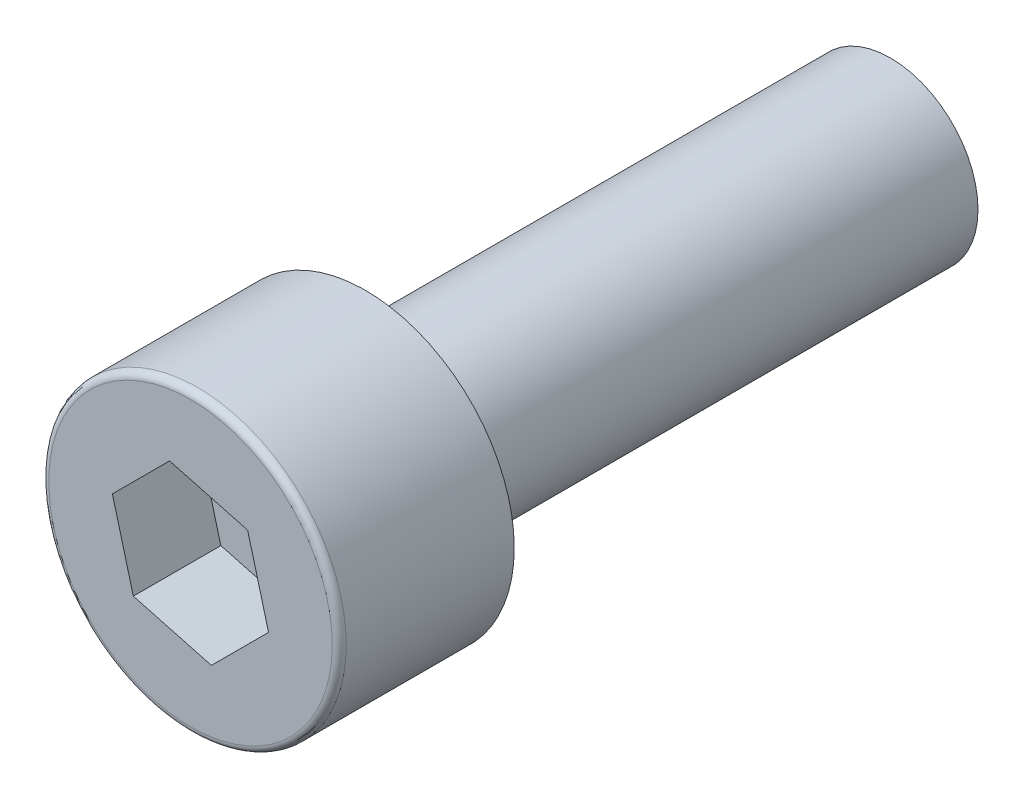
ISO-10303-21;
HEADER;
FILE_DESCRIPTION(('STEP AP214'),'2;1');
FILE_NAME('part.step','',(''),(''),'','','');
FILE_SCHEMA(('AUTOMOTIVE_DESIGN { 1 0 10303 214 1 1 1 1 }'));
ENDSEC;
DATA;
#1=APPLICATION_CONTEXT('core data for automotive mechanical design processes');
#2=APPLICATION_PROTOCOL_DEFINITION('international standard','automotive_design',2000,#1);
#3=PRODUCT_CONTEXT('',#1,'mechanical');
#4=PRODUCT('Part','Part','',(#3));
#5=PRODUCT_RELATED_PRODUCT_CATEGORY('part','',(#4));
#6=PRODUCT_DEFINITION_FORMATION('','',#4);
#7=PRODUCT_DEFINITION_CONTEXT('part definition',#1,'design');
#8=PRODUCT_DEFINITION('design','',#6,#7);
#9=PRODUCT_DEFINITION_SHAPE('','',#8);
#10=(LENGTH_UNIT() NAMED_UNIT(*) SI_UNIT(.MILLI.,.METRE.));
#11=(NAMED_UNIT(*) PLANE_ANGLE_UNIT() SI_UNIT($,.RADIAN.));
#12=(NAMED_UNIT(*) SI_UNIT($,.STERADIAN.) SOLID_ANGLE_UNIT());
#13=UNCERTAINTY_MEASURE_WITH_UNIT(LENGTH_MEASURE(1.E-05),#10,'distance_accuracy_value','');
#14=(GEOMETRIC_REPRESENTATION_CONTEXT(3) GLOBAL_UNCERTAINTY_ASSIGNED_CONTEXT((#13)) GLOBAL_UNIT_ASSIGNED_CONTEXT((#10,
#11,#12)) REPRESENTATION_CONTEXT('',''));
#15=CARTESIAN_POINT('',(0.,0.,0.));
#16=DIRECTION('',(0.,0.,1.));
#17=DIRECTION('',(1.,0.,0.));
#18=AXIS2_PLACEMENT_3D('',#15,#16,#17);
#19=CARTESIAN_POINT('',(0.,0.,0.));
#20=DIRECTION('',(0.,0.,1.));
#21=DIRECTION('',(1.,0.,0.));
#22=AXIS2_PLACEMENT_3D('',#19,#20,#21);
#23=PLANE('',#22);
#24=CARTESIAN_POINT('',(0.,0.,0.));
#25=DIRECTION('',(0.,0.,1.));
#26=DIRECTION('',(1.,0.,0.));
#27=AXIS2_PLACEMENT_3D('',#24,#25,#26);
#28=CIRCLE('',#27,4.25);
#29=CARTESIAN_POINT('',(4.25,0.,0.));
#30=VERTEX_POINT('',#29);
#31=EDGE_CURVE('E135',#30,#30,#28,.T.);
#32=ORIENTED_EDGE('',*,*,#31,.F.);
#33=EDGE_LOOP('',(#32));
#34=FACE_BOUND('',#33,.T.);
#35=CARTESIAN_POINT('',(0.,0.,0.));
#36=DIRECTION('',(0.,0.,1.));
#37=DIRECTION('',(1.,0.,0.));
#38=AXIS2_PLACEMENT_3D('',#35,#36,#37);
#39=CIRCLE('',#38,2.5);
#40=CARTESIAN_POINT('',(2.5,0.,0.));
#41=VERTEX_POINT('',#40);
#42=EDGE_CURVE('E143',#41,#41,#39,.F.);
#43=ORIENTED_EDGE('',*,*,#42,.F.);
#44=EDGE_LOOP('',(#43));
#45=FACE_BOUND('',#44,.T.);
#46=ADVANCED_FACE('F32',(#34,#45),#23,.F.);
#47=CARTESIAN_POINT('',(0.,0.,5.));
#48=DIRECTION('',(0.,0.,-1.));
#49=DIRECTION('',(-1.,0.,0.));
#50=AXIS2_PLACEMENT_3D('',#47,#48,#49);
#51=CYLINDRICAL_SURFACE('',#50,4.25);
#52=CARTESIAN_POINT('',(0.,0.,4.8));
#53=DIRECTION('',(0.,0.,1.));
#54=DIRECTION('',(1.,0.,0.));
#55=AXIS2_PLACEMENT_3D('',#52,#53,#54);
#56=CIRCLE('',#55,4.25);
#57=CARTESIAN_POINT('',(4.25,0.,4.8));
#58=VERTEX_POINT('',#57);
#59=EDGE_CURVE('E11',#58,#58,#56,.F.);
#60=ORIENTED_EDGE('',*,*,#59,.T.);
#61=EDGE_LOOP('',(#60));
#62=FACE_BOUND('',#61,.T.);
#63=ORIENTED_EDGE('',*,*,#31,.T.);
#64=EDGE_LOOP('',(#63));
#65=FACE_BOUND('',#64,.T.);
#66=ADVANCED_FACE('F162',(#62,#65),#51,.T.);
#67=CARTESIAN_POINT('',(0.,0.,5.));
#68=DIRECTION('',(0.,0.,1.));
#69=DIRECTION('',(1.,0.,0.));
#70=AXIS2_PLACEMENT_3D('',#67,#68,#69);
#71=PLANE('',#70);
#72=CARTESIAN_POINT('',(0.,0.,5.));
#73=DIRECTION('',(0.,0.,1.));
#74=DIRECTION('',(1.,0.,0.));
#75=AXIS2_PLACEMENT_3D('',#72,#73,#74);
#76=CIRCLE('',#75,4.05);
#77=CARTESIAN_POINT('',(4.05,0.,5.));
#78=VERTEX_POINT('',#77);
#79=EDGE_CURVE('E40',#78,#78,#76,.T.);
#80=ORIENTED_EDGE('',*,*,#79,.T.);
#81=EDGE_LOOP('',(#80));
#82=FACE_BOUND('',#81,.T.);
#83=DIRECTION('',(0.258819045102521,-0.965925826289068,0.));
#84=VECTOR('',#83,1.);
#85=CARTESIAN_POINT('',(-2.23071014330082,0.597716981445369,5.));
#86=LINE('',#85,#84);
#87=CARTESIAN_POINT('',(-2.23071014330082,0.597716981445369,5.));
#88=VERTEX_POINT('',#87);
#89=CARTESIAN_POINT('',(-1.63299316185545,-1.63299316185545,5.));
#90=VERTEX_POINT('',#89);
#91=EDGE_CURVE('E47',#88,#90,#86,.T.);
#92=ORIENTED_EDGE('',*,*,#91,.F.);
#93=DIRECTION('',(-0.707106781186547,-0.707106781186548,0.));
#94=VECTOR('',#93,1.);
#95=CARTESIAN_POINT('',(-0.597716981445369,2.23071014330082,5.));
#96=LINE('',#95,#94);
#97=CARTESIAN_POINT('',(-0.597716981445369,2.23071014330082,5.));
#98=VERTEX_POINT('',#97);
#99=EDGE_CURVE('E131',#98,#88,#96,.T.);
#100=ORIENTED_EDGE('',*,*,#99,.F.);
#101=DIRECTION('',(-0.965925826289068,0.258819045102521,0.));
#102=VECTOR('',#101,1.);
#103=CARTESIAN_POINT('',(1.63299316185545,1.63299316185545,5.));
#104=LINE('',#103,#102);
#105=CARTESIAN_POINT('',(1.63299316185545,1.63299316185545,5.));
#106=VERTEX_POINT('',#105);
#107=EDGE_CURVE('E129',#106,#98,#104,.T.);
#108=ORIENTED_EDGE('',*,*,#107,.F.);
#109=DIRECTION('',(-0.258819045102521,0.965925826289068,0.));
#110=VECTOR('',#109,1.);
#111=CARTESIAN_POINT('',(2.23071014330082,-0.597716981445369,5.));
#112=LINE('',#111,#110);
#113=CARTESIAN_POINT('',(2.23071014330082,-0.597716981445369,5.));
#114=VERTEX_POINT('',#113);
#115=EDGE_CURVE('E95',#114,#106,#112,.T.);
#116=ORIENTED_EDGE('',*,*,#115,.F.);
#117=DIRECTION('',(0.707106781186547,0.707106781186547,0.));
#118=VECTOR('',#117,1.);
#119=CARTESIAN_POINT('',(0.597716981445369,-2.23071014330082,5.));
#120=LINE('',#119,#118);
#121=CARTESIAN_POINT('',(0.597716981445369,-2.23071014330082,5.));
#122=VERTEX_POINT('',#121);
#123=EDGE_CURVE('E125',#122,#114,#120,.T.);
#124=ORIENTED_EDGE('',*,*,#123,.F.);
#125=DIRECTION('',(0.965925826289068,-0.258819045102521,0.));
#126=VECTOR('',#125,1.);
#127=CARTESIAN_POINT('',(-1.63299316185545,-1.63299316185545,5.));
#128=LINE('',#127,#126);
#129=EDGE_CURVE('E121',#90,#122,#128,.T.);
#130=ORIENTED_EDGE('',*,*,#129,.F.);
#131=EDGE_LOOP('',(#92,#100,#108,#116,#124,#130));
#132=FACE_BOUND('',#131,.T.);
#133=ADVANCED_FACE('F148',(#82,#132),#71,.T.);
#134=CARTESIAN_POINT('',(-2.23071014330082,0.597716981445369,2.5));
#135=DIRECTION('',(-0.965925826289068,-0.258819045102521,0.));
#136=DIRECTION('',(0.258819045102521,-0.965925826289068,0.));
#137=AXIS2_PLACEMENT_3D('',#134,#135,#136);
#138=PLANE('',#137);
#139=ORIENTED_EDGE('',*,*,#91,.T.);
#140=DIRECTION('',(0.,0.,1.));
#141=VECTOR('',#140,1.);
#142=CARTESIAN_POINT('',(-1.63299316185545,-1.63299316185545,2.5));
#143=LINE('',#142,#141);
#144=CARTESIAN_POINT('',(-1.63299316185545,-1.63299316185545,2.5));
#145=VERTEX_POINT('',#144);
#146=EDGE_CURVE('E77',#145,#90,#143,.T.);
#147=ORIENTED_EDGE('',*,*,#146,.F.);
#148=DIRECTION('',(0.258819045102521,-0.965925826289068,0.));
#149=VECTOR('',#148,1.);
#150=CARTESIAN_POINT('',(-2.23071014330082,0.597716981445369,2.5));
#151=LINE('',#150,#149);
#152=CARTESIAN_POINT('',(-2.23071014330082,0.597716981445369,2.5));
#153=VERTEX_POINT('',#152);
#154=EDGE_CURVE('E133',#153,#145,#151,.T.);
#155=ORIENTED_EDGE('',*,*,#154,.F.);
#156=DIRECTION('',(0.,0.,1.));
#157=VECTOR('',#156,1.);
#158=CARTESIAN_POINT('',(-2.23071014330082,0.597716981445369,2.5));
#159=LINE('',#158,#157);
#160=EDGE_CURVE('E55',#153,#88,#159,.T.);
#161=ORIENTED_EDGE('',*,*,#160,.T.);
#162=EDGE_LOOP('',(#139,#147,#155,#161));
#163=FACE_BOUND('',#162,.T.);
#164=ADVANCED_FACE('F174',(#163),#138,.F.);
#165=CARTESIAN_POINT('',(-0.597716981445369,2.23071014330082,2.5));
#166=DIRECTION('',(-0.707106781186548,0.707106781186547,0.));
#167=DIRECTION('',(-0.707106781186547,-0.707106781186548,0.));
#168=AXIS2_PLACEMENT_3D('',#165,#166,#167);
#169=PLANE('',#168);
#170=ORIENTED_EDGE('',*,*,#99,.T.);
#171=ORIENTED_EDGE('',*,*,#160,.F.);
#172=DIRECTION('',(-0.707106781186547,-0.707106781186548,0.));
#173=VECTOR('',#172,1.);
#174=CARTESIAN_POINT('',(-0.597716981445369,2.23071014330082,2.5));
#175=LINE('',#174,#173);
#176=CARTESIAN_POINT('',(-0.597716981445369,2.23071014330082,2.5));
#177=VERTEX_POINT('',#176);
#178=EDGE_CURVE('E107',#177,#153,#175,.T.);
#179=ORIENTED_EDGE('',*,*,#178,.F.);
#180=DIRECTION('',(0.,0.,1.));
#181=VECTOR('',#180,1.);
#182=CARTESIAN_POINT('',(-0.597716981445369,2.23071014330082,2.5));
#183=LINE('',#182,#181);
#184=EDGE_CURVE('E99',#177,#98,#183,.T.);
#185=ORIENTED_EDGE('',*,*,#184,.T.);
#186=EDGE_LOOP('',(#170,#171,#179,#185));
#187=FACE_BOUND('',#186,.T.);
#188=ADVANCED_FACE('F177',(#187),#169,.F.);
#189=CARTESIAN_POINT('',(1.63299316185545,1.63299316185545,2.5));
#190=DIRECTION('',(0.258819045102521,0.965925826289068,0.));
#191=DIRECTION('',(-0.965925826289068,0.258819045102521,0.));
#192=AXIS2_PLACEMENT_3D('',#189,#190,#191);
#193=PLANE('',#192);
#194=ORIENTED_EDGE('',*,*,#107,.T.);
#195=ORIENTED_EDGE('',*,*,#184,.F.);
#196=DIRECTION('',(-0.965925826289068,0.258819045102521,0.));
#197=VECTOR('',#196,1.);
#198=CARTESIAN_POINT('',(1.63299316185545,1.63299316185545,2.5));
#199=LINE('',#198,#197);
#200=CARTESIAN_POINT('',(1.63299316185545,1.63299316185545,2.5));
#201=VERTEX_POINT('',#200);
#202=EDGE_CURVE('E103',#201,#177,#199,.T.);
#203=ORIENTED_EDGE('',*,*,#202,.F.);
#204=DIRECTION('',(0.,0.,1.));
#205=VECTOR('',#204,1.);
#206=CARTESIAN_POINT('',(1.63299316185545,1.63299316185545,2.5));
#207=LINE('',#206,#205);
#208=EDGE_CURVE('E88',#201,#106,#207,.T.);
#209=ORIENTED_EDGE('',*,*,#208,.T.);
#210=EDGE_LOOP('',(#194,#195,#203,#209));
#211=FACE_BOUND('',#210,.T.);
#212=ADVANCED_FACE('F104',(#211),#193,.F.);
#213=CARTESIAN_POINT('',(2.23071014330082,-0.597716981445369,2.5));
#214=DIRECTION('',(0.965925826289068,0.258819045102521,0.));
#215=DIRECTION('',(-0.258819045102521,0.965925826289068,0.));
#216=AXIS2_PLACEMENT_3D('',#213,#214,#215);
#217=PLANE('',#216);
#218=ORIENTED_EDGE('',*,*,#115,.T.);
#219=ORIENTED_EDGE('',*,*,#208,.F.);
#220=DIRECTION('',(-0.258819045102521,0.965925826289068,0.));
#221=VECTOR('',#220,1.);
#222=CARTESIAN_POINT('',(2.23071014330082,-0.597716981445369,2.5));
#223=LINE('',#222,#221);
#224=CARTESIAN_POINT('',(2.23071014330082,-0.597716981445369,2.5));
#225=VERTEX_POINT('',#224);
#226=EDGE_CURVE('E92',#225,#201,#223,.T.);
#227=ORIENTED_EDGE('',*,*,#226,.F.);
#228=DIRECTION('',(0.,0.,1.));
#229=VECTOR('',#228,1.);
#230=CARTESIAN_POINT('',(2.23071014330082,-0.597716981445369,2.5));
#231=LINE('',#230,#229);
#232=EDGE_CURVE('E100',#225,#114,#231,.T.);
#233=ORIENTED_EDGE('',*,*,#232,.T.);
#234=EDGE_LOOP('',(#218,#219,#227,#233));
#235=FACE_BOUND('',#234,.T.);
#236=ADVANCED_FACE('F90',(#235),#217,.F.);
#237=CARTESIAN_POINT('',(0.597716981445369,-2.23071014330082,2.5));
#238=DIRECTION('',(0.707106781186548,-0.707106781186548,0.));
#239=DIRECTION('',(0.707106781186548,0.707106781186548,0.));
#240=AXIS2_PLACEMENT_3D('',#237,#238,#239);
#241=PLANE('',#240);
#242=ORIENTED_EDGE('',*,*,#123,.T.);
#243=ORIENTED_EDGE('',*,*,#232,.F.);
#244=DIRECTION('',(0.707106781186547,0.707106781186547,0.));
#245=VECTOR('',#244,1.);
#246=CARTESIAN_POINT('',(0.597716981445369,-2.23071014330082,2.5));
#247=LINE('',#246,#245);
#248=CARTESIAN_POINT('',(0.597716981445369,-2.23071014330082,2.5));
#249=VERTEX_POINT('',#248);
#250=EDGE_CURVE('E113',#249,#225,#247,.T.);
#251=ORIENTED_EDGE('',*,*,#250,.F.);
#252=DIRECTION('',(0.,0.,1.));
#253=VECTOR('',#252,1.);
#254=CARTESIAN_POINT('',(0.597716981445369,-2.23071014330082,2.5));
#255=LINE('',#254,#253);
#256=EDGE_CURVE('E138',#249,#122,#255,.T.);
#257=ORIENTED_EDGE('',*,*,#256,.T.);
#258=EDGE_LOOP('',(#242,#243,#251,#257));
#259=FACE_BOUND('',#258,.T.);
#260=ADVANCED_FACE('F181',(#259),#241,.F.);
#261=CARTESIAN_POINT('',(-1.63299316185545,-1.63299316185545,2.5));
#262=DIRECTION('',(-0.258819045102521,-0.965925826289068,0.));
#263=DIRECTION('',(0.965925826289068,-0.258819045102521,0.));
#264=AXIS2_PLACEMENT_3D('',#261,#262,#263);
#265=PLANE('',#264);
#266=ORIENTED_EDGE('',*,*,#129,.T.);
#267=ORIENTED_EDGE('',*,*,#256,.F.);
#268=DIRECTION('',(0.965925826289068,-0.258819045102521,0.));
#269=VECTOR('',#268,1.);
#270=CARTESIAN_POINT('',(-1.63299316185545,-1.63299316185545,2.5));
#271=LINE('',#270,#269);
#272=EDGE_CURVE('E115',#145,#249,#271,.T.);
#273=ORIENTED_EDGE('',*,*,#272,.F.);
#274=ORIENTED_EDGE('',*,*,#146,.T.);
#275=EDGE_LOOP('',(#266,#267,#273,#274));
#276=FACE_BOUND('',#275,.T.);
#277=ADVANCED_FACE('F178',(#276),#265,.F.);
#278=CARTESIAN_POINT('',(0.,0.,2.5));
#279=DIRECTION('',(0.,0.,1.));
#280=DIRECTION('',(1.,0.,0.));
#281=AXIS2_PLACEMENT_3D('',#278,#279,#280);
#282=PLANE('',#281);
#283=ORIENTED_EDGE('',*,*,#154,.T.);
#284=ORIENTED_EDGE('',*,*,#272,.T.);
#285=ORIENTED_EDGE('',*,*,#250,.T.);
#286=ORIENTED_EDGE('',*,*,#226,.T.);
#287=ORIENTED_EDGE('',*,*,#202,.T.);
#288=ORIENTED_EDGE('',*,*,#178,.T.);
#289=EDGE_LOOP('',(#283,#284,#285,#286,#287,#288));
#290=FACE_BOUND('',#289,.T.);
#291=ADVANCED_FACE('F110',(#290),#282,.T.);
#292=CARTESIAN_POINT('',(0.,0.,-15.));
#293=DIRECTION('',(0.,0.,1.));
#294=DIRECTION('',(1.,0.,0.));
#295=AXIS2_PLACEMENT_3D('',#292,#293,#294);
#296=CYLINDRICAL_SURFACE('',#295,2.5);
#297=CARTESIAN_POINT('',(0.,0.,-15.));
#298=DIRECTION('',(0.,0.,-1.));
#299=DIRECTION('',(-1.,0.,0.));
#300=AXIS2_PLACEMENT_3D('',#297,#298,#299);
#301=CIRCLE('',#300,2.5);
#302=CARTESIAN_POINT('',(-2.5,0.,-15.));
#303=VERTEX_POINT('',#302);
#304=EDGE_CURVE('E122',#303,#303,#301,.T.);
#305=ORIENTED_EDGE('',*,*,#304,.F.);
#306=EDGE_LOOP('',(#305));
#307=FACE_BOUND('',#306,.T.);
#308=ORIENTED_EDGE('',*,*,#42,.T.);
#309=EDGE_LOOP('',(#308));
#310=FACE_BOUND('',#309,.T.);
#311=ADVANCED_FACE('F157',(#307,#310),#296,.T.);
#312=CARTESIAN_POINT('',(0.,0.,-15.));
#313=DIRECTION('',(0.,0.,-1.));
#314=DIRECTION('',(-1.,0.,0.));
#315=AXIS2_PLACEMENT_3D('',#312,#313,#314);
#316=PLANE('',#315);
#317=ORIENTED_EDGE('',*,*,#304,.T.);
#318=EDGE_LOOP('',(#317));
#319=FACE_BOUND('',#318,.T.);
#320=ADVANCED_FACE('F152',(#319),#316,.T.);
#321=CARTESIAN_POINT('',(0.,0.,4.8));
#322=DIRECTION('',(0.,0.,1.));
#323=DIRECTION('',(1.,0.,0.));
#324=AXIS2_PLACEMENT_3D('',#321,#322,#323);
#325=TOROIDAL_SURFACE('',#324,4.05,0.2);
#326=ORIENTED_EDGE('',*,*,#59,.F.);
#327=EDGE_LOOP('',(#326));
#328=FACE_BOUND('',#327,.T.);
#329=ORIENTED_EDGE('',*,*,#79,.F.);
#330=EDGE_LOOP('',(#329));
#331=FACE_BOUND('',#330,.T.);
#332=ADVANCED_FACE('F34',(#328,#331),#325,.T.);
#333=CLOSED_SHELL('',(#46,#66,#133,#164,#188,#212,#236,#260,#277,#291,#311,#320,#332));
#334=MANIFOLD_SOLID_BREP('B2',#333);
#335=ADVANCED_BREP_SHAPE_REPRESENTATION('',(#18,#334),#14);
#336=SHAPE_DEFINITION_REPRESENTATION(#9,#335);
ENDSEC;
END-ISO-10303-21;
